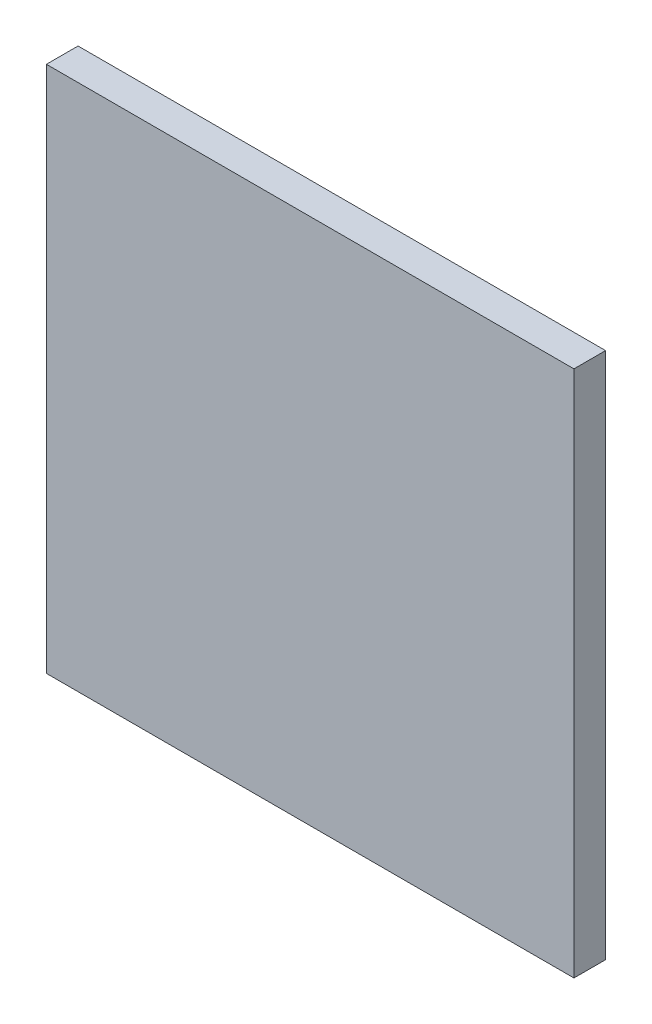
ISO-10303-21;
HEADER;
FILE_DESCRIPTION(('STEP AP214'),'2;1');
FILE_NAME('part.step','',(''),(''),'','','');
FILE_SCHEMA(('AUTOMOTIVE_DESIGN { 1 0 10303 214 1 1 1 1 }'));
ENDSEC;
DATA;
#1=APPLICATION_CONTEXT('core data for automotive mechanical design processes');
#2=APPLICATION_PROTOCOL_DEFINITION('international standard','automotive_design',2000,#1);
#3=PRODUCT_CONTEXT('',#1,'mechanical');
#4=PRODUCT('Part','Part','',(#3));
#5=PRODUCT_RELATED_PRODUCT_CATEGORY('part','',(#4));
#6=PRODUCT_DEFINITION_FORMATION('','',#4);
#7=PRODUCT_DEFINITION_CONTEXT('part definition',#1,'design');
#8=PRODUCT_DEFINITION('design','',#6,#7);
#9=PRODUCT_DEFINITION_SHAPE('','',#8);
#10=(LENGTH_UNIT() NAMED_UNIT(*) SI_UNIT(.MILLI.,.METRE.));
#11=(NAMED_UNIT(*) PLANE_ANGLE_UNIT() SI_UNIT($,.RADIAN.));
#12=(NAMED_UNIT(*) SI_UNIT($,.STERADIAN.) SOLID_ANGLE_UNIT());
#13=UNCERTAINTY_MEASURE_WITH_UNIT(LENGTH_MEASURE(1.E-05),#10,'distance_accuracy_value','');
#14=(GEOMETRIC_REPRESENTATION_CONTEXT(3) GLOBAL_UNCERTAINTY_ASSIGNED_CONTEXT((#13)) GLOBAL_UNIT_ASSIGNED_CONTEXT((#10,
#11,#12)) REPRESENTATION_CONTEXT('',''));
#15=CARTESIAN_POINT('',(0.,0.,0.));
#16=DIRECTION('',(0.,0.,1.));
#17=DIRECTION('',(1.,0.,0.));
#18=AXIS2_PLACEMENT_3D('',#15,#16,#17);
#19=CARTESIAN_POINT('',(0.,0.,300.));
#20=DIRECTION('',(1.,0.,0.));
#21=DIRECTION('',(0.,0.,-1.));
#22=AXIS2_PLACEMENT_3D('',#19,#20,#21);
#23=PLANE('',#22);
#24=DIRECTION('',(0.,-1.,0.));
#25=VECTOR('',#24,1.);
#26=CARTESIAN_POINT('',(0.,0.,0.));
#27=LINE('',#26,#25);
#28=CARTESIAN_POINT('',(0.,5000.,0.));
#29=VERTEX_POINT('',#28);
#30=CARTESIAN_POINT('',(0.,0.,0.));
#31=VERTEX_POINT('',#30);
#32=EDGE_CURVE('E113',#29,#31,#27,.T.);
#33=ORIENTED_EDGE('',*,*,#32,.T.);
#34=DIRECTION('',(0.,0.,-1.));
#35=VECTOR('',#34,1.);
#36=CARTESIAN_POINT('',(0.,0.,300.));
#37=LINE('',#36,#35);
#38=CARTESIAN_POINT('',(0.,0.,300.));
#39=VERTEX_POINT('',#38);
#40=EDGE_CURVE('E11',#39,#31,#37,.T.);
#41=ORIENTED_EDGE('',*,*,#40,.F.);
#42=DIRECTION('',(0.,-1.,0.));
#43=VECTOR('',#42,1.);
#44=CARTESIAN_POINT('',(0.,0.,300.));
#45=LINE('',#44,#43);
#46=CARTESIAN_POINT('',(0.,5000.,300.));
#47=VERTEX_POINT('',#46);
#48=EDGE_CURVE('E97',#47,#39,#45,.T.);
#49=ORIENTED_EDGE('',*,*,#48,.F.);
#50=DIRECTION('',(0.,0.,-1.));
#51=VECTOR('',#50,1.);
#52=CARTESIAN_POINT('',(0.,5000.,300.));
#53=LINE('',#52,#51);
#54=EDGE_CURVE('E109',#47,#29,#53,.T.);
#55=ORIENTED_EDGE('',*,*,#54,.T.);
#56=EDGE_LOOP('',(#33,#41,#49,#55));
#57=FACE_BOUND('',#56,.T.);
#58=ADVANCED_FACE('F45',(#57),#23,.F.);
#59=CARTESIAN_POINT('',(0.,0.,300.));
#60=DIRECTION('',(0.,1.,0.));
#61=DIRECTION('',(0.,0.,1.));
#62=AXIS2_PLACEMENT_3D('',#59,#60,#61);
#63=PLANE('',#62);
#64=DIRECTION('',(1.,0.,0.));
#65=VECTOR('',#64,1.);
#66=CARTESIAN_POINT('',(0.,0.,0.));
#67=LINE('',#66,#65);
#68=CARTESIAN_POINT('',(5000.,0.,0.));
#69=VERTEX_POINT('',#68);
#70=EDGE_CURVE('E102',#31,#69,#67,.T.);
#71=ORIENTED_EDGE('',*,*,#70,.T.);
#72=DIRECTION('',(0.,0.,-1.));
#73=VECTOR('',#72,1.);
#74=CARTESIAN_POINT('',(5000.,0.,300.));
#75=LINE('',#74,#73);
#76=CARTESIAN_POINT('',(5000.,0.,300.));
#77=VERTEX_POINT('',#76);
#78=EDGE_CURVE('E54',#77,#69,#75,.T.);
#79=ORIENTED_EDGE('',*,*,#78,.F.);
#80=DIRECTION('',(1.,0.,0.));
#81=VECTOR('',#80,1.);
#82=CARTESIAN_POINT('',(0.,0.,300.));
#83=LINE('',#82,#81);
#84=EDGE_CURVE('E92',#39,#77,#83,.T.);
#85=ORIENTED_EDGE('',*,*,#84,.F.);
#86=ORIENTED_EDGE('',*,*,#40,.T.);
#87=EDGE_LOOP('',(#71,#79,#85,#86));
#88=FACE_BOUND('',#87,.T.);
#89=ADVANCED_FACE('F101',(#88),#63,.F.);
#90=CARTESIAN_POINT('',(5000.,0.,300.));
#91=DIRECTION('',(-1.,0.,0.));
#92=DIRECTION('',(0.,0.,1.));
#93=AXIS2_PLACEMENT_3D('',#90,#91,#92);
#94=PLANE('',#93);
#95=DIRECTION('',(0.,1.,0.));
#96=VECTOR('',#95,1.);
#97=CARTESIAN_POINT('',(5000.,0.,0.));
#98=LINE('',#97,#96);
#99=CARTESIAN_POINT('',(5000.,5000.,0.));
#100=VERTEX_POINT('',#99);
#101=EDGE_CURVE('E79',#69,#100,#98,.T.);
#102=ORIENTED_EDGE('',*,*,#101,.T.);
#103=DIRECTION('',(0.,0.,-1.));
#104=VECTOR('',#103,1.);
#105=CARTESIAN_POINT('',(5000.,5000.,300.));
#106=LINE('',#105,#104);
#107=CARTESIAN_POINT('',(5000.,5000.,300.));
#108=VERTEX_POINT('',#107);
#109=EDGE_CURVE('E104',#108,#100,#106,.T.);
#110=ORIENTED_EDGE('',*,*,#109,.F.);
#111=DIRECTION('',(0.,1.,0.));
#112=VECTOR('',#111,1.);
#113=CARTESIAN_POINT('',(5000.,0.,300.));
#114=LINE('',#113,#112);
#115=EDGE_CURVE('E95',#77,#108,#114,.T.);
#116=ORIENTED_EDGE('',*,*,#115,.F.);
#117=ORIENTED_EDGE('',*,*,#78,.T.);
#118=EDGE_LOOP('',(#102,#110,#116,#117));
#119=FACE_BOUND('',#118,.T.);
#120=ADVANCED_FACE('F105',(#119),#94,.F.);
#121=CARTESIAN_POINT('',(0.,5000.,300.));
#122=DIRECTION('',(0.,-1.,0.));
#123=DIRECTION('',(0.,0.,-1.));
#124=AXIS2_PLACEMENT_3D('',#121,#122,#123);
#125=PLANE('',#124);
#126=DIRECTION('',(-1.,0.,0.));
#127=VECTOR('',#126,1.);
#128=CARTESIAN_POINT('',(0.,5000.,0.));
#129=LINE('',#128,#127);
#130=EDGE_CURVE('E85',#100,#29,#129,.T.);
#131=ORIENTED_EDGE('',*,*,#130,.T.);
#132=ORIENTED_EDGE('',*,*,#54,.F.);
#133=DIRECTION('',(-1.,0.,0.));
#134=VECTOR('',#133,1.);
#135=CARTESIAN_POINT('',(0.,5000.,300.));
#136=LINE('',#135,#134);
#137=EDGE_CURVE('E62',#108,#47,#136,.T.);
#138=ORIENTED_EDGE('',*,*,#137,.F.);
#139=ORIENTED_EDGE('',*,*,#109,.T.);
#140=EDGE_LOOP('',(#131,#132,#138,#139));
#141=FACE_BOUND('',#140,.T.);
#142=ADVANCED_FACE('F126',(#141),#125,.F.);
#143=CARTESIAN_POINT('',(0.,0.,300.));
#144=DIRECTION('',(0.,0.,-1.));
#145=DIRECTION('',(-1.,0.,0.));
#146=AXIS2_PLACEMENT_3D('',#143,#144,#145);
#147=PLANE('',#146);
#148=ORIENTED_EDGE('',*,*,#48,.T.);
#149=ORIENTED_EDGE('',*,*,#84,.T.);
#150=ORIENTED_EDGE('',*,*,#115,.T.);
#151=ORIENTED_EDGE('',*,*,#137,.T.);
#152=EDGE_LOOP('',(#148,#149,#150,#151));
#153=FACE_BOUND('',#152,.T.);
#154=ADVANCED_FACE('F93',(#153),#147,.F.);
#155=CARTESIAN_POINT('',(0.,0.,0.));
#156=DIRECTION('',(0.,0.,-1.));
#157=DIRECTION('',(-1.,0.,0.));
#158=AXIS2_PLACEMENT_3D('',#155,#156,#157);
#159=PLANE('',#158);
#160=ORIENTED_EDGE('',*,*,#32,.F.);
#161=ORIENTED_EDGE('',*,*,#130,.F.);
#162=ORIENTED_EDGE('',*,*,#101,.F.);
#163=ORIENTED_EDGE('',*,*,#70,.F.);
#164=EDGE_LOOP('',(#160,#161,#162,#163));
#165=FACE_BOUND('',#164,.T.);
#166=ADVANCED_FACE('F129',(#165),#159,.T.);
#167=CLOSED_SHELL('',(#58,#89,#120,#142,#154,#166));
#168=MANIFOLD_SOLID_BREP('B2',#167);
#169=ADVANCED_BREP_SHAPE_REPRESENTATION('',(#18,#168),#14);
#170=SHAPE_DEFINITION_REPRESENTATION(#9,#169);
ENDSEC;
END-ISO-10303-21;
